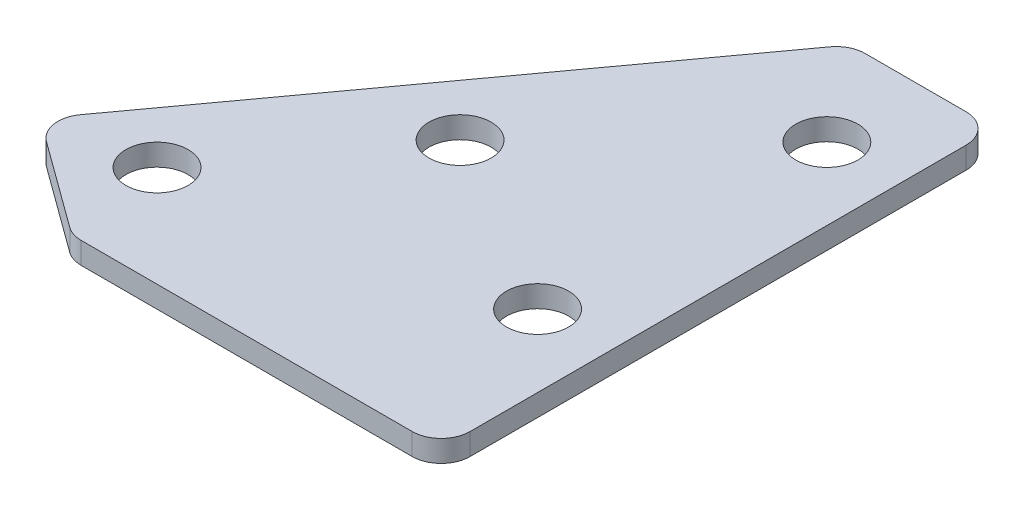
ISO-10303-21;
HEADER;
FILE_DESCRIPTION(('STEP AP214'),'2;1');
FILE_NAME('part.step','',(''),(''),'','','');
FILE_SCHEMA(('AUTOMOTIVE_DESIGN { 1 0 10303 214 1 1 1 1 }'));
ENDSEC;
DATA;
#1=APPLICATION_CONTEXT('core data for automotive mechanical design processes');
#2=APPLICATION_PROTOCOL_DEFINITION('international standard','automotive_design',2000,#1);
#3=PRODUCT_CONTEXT('',#1,'mechanical');
#4=PRODUCT('Part','Part','',(#3));
#5=PRODUCT_RELATED_PRODUCT_CATEGORY('part','',(#4));
#6=PRODUCT_DEFINITION_FORMATION('','',#4);
#7=PRODUCT_DEFINITION_CONTEXT('part definition',#1,'design');
#8=PRODUCT_DEFINITION('design','',#6,#7);
#9=PRODUCT_DEFINITION_SHAPE('','',#8);
#10=(LENGTH_UNIT() NAMED_UNIT(*) SI_UNIT(.MILLI.,.METRE.));
#11=(NAMED_UNIT(*) PLANE_ANGLE_UNIT() SI_UNIT($,.RADIAN.));
#12=(NAMED_UNIT(*) SI_UNIT($,.STERADIAN.) SOLID_ANGLE_UNIT());
#13=UNCERTAINTY_MEASURE_WITH_UNIT(LENGTH_MEASURE(1.E-05),#10,'distance_accuracy_value','');
#14=(GEOMETRIC_REPRESENTATION_CONTEXT(3) GLOBAL_UNCERTAINTY_ASSIGNED_CONTEXT((#13)) GLOBAL_UNIT_ASSIGNED_CONTEXT((#10,
#11,#12)) REPRESENTATION_CONTEXT('',''));
#15=CARTESIAN_POINT('',(0.,0.,0.));
#16=DIRECTION('',(0.,0.,1.));
#17=DIRECTION('',(1.,0.,0.));
#18=AXIS2_PLACEMENT_3D('',#15,#16,#17);
#19=CARTESIAN_POINT('',(0.,1.5,0.));
#20=DIRECTION('',(0.,1.,0.));
#21=DIRECTION('',(0.,0.,1.));
#22=AXIS2_PLACEMENT_3D('',#19,#20,#21);
#23=PLANE('',#22);
#24=CARTESIAN_POINT('',(167.865866110565,1.5,-230.317283317926));
#25=DIRECTION('',(0.,1.,0.));
#26=DIRECTION('',(0.,0.,1.));
#27=AXIS2_PLACEMENT_3D('',#24,#25,#26);
#28=CIRCLE('',#27,2.15000000000002);
#29=CARTESIAN_POINT('',(167.865866110565,1.5,-228.167283317926));
#30=VERTEX_POINT('',#29);
#31=EDGE_CURVE('E221',#30,#30,#28,.T.);
#32=ORIENTED_EDGE('',*,*,#31,.F.);
#33=EDGE_LOOP('',(#32));
#34=FACE_BOUND('',#33,.T.);
#35=CARTESIAN_POINT('',(176.700911695332,1.5,-242.439245597817));
#36=DIRECTION('',(0.,1.,0.));
#37=DIRECTION('',(0.,0.,1.));
#38=AXIS2_PLACEMENT_3D('',#35,#36,#37);
#39=CIRCLE('',#38,2.15000000000002);
#40=CARTESIAN_POINT('',(176.700911695332,1.5,-240.289245597817));
#41=VERTEX_POINT('',#40);
#42=EDGE_CURVE('E143',#41,#41,#39,.T.);
#43=ORIENTED_EDGE('',*,*,#42,.F.);
#44=EDGE_LOOP('',(#43));
#45=FACE_BOUND('',#44,.T.);
#46=DIRECTION('',(0.80813081865939,0.,0.589003038984438));
#47=VECTOR('',#46,1.);
#48=CARTESIAN_POINT('',(168.96150500894,1.5,-223.331614029707));
#49=LINE('',#48,#47);
#50=CARTESIAN_POINT('',(162.496458459665,1.5,-228.043638341582));
#51=VERTEX_POINT('',#50);
#52=CARTESIAN_POINT('',(168.435003825314,1.5,-223.715352392388));
#53=VERTEX_POINT('',#52);
#54=EDGE_CURVE('E152',#51,#53,#49,.T.);
#55=ORIENTED_EDGE('',*,*,#54,.T.);
#56=CARTESIAN_POINT('',(169.613009903283,1.5,-225.331614029707));
#57=DIRECTION('',(0.,1.,0.));
#58=DIRECTION('',(0.,0.,1.));
#59=AXIS2_PLACEMENT_3D('',#56,#57,#58);
#60=CIRCLE('',#59,2.);
#61=CARTESIAN_POINT('',(169.613009903283,1.5,-223.331614029707));
#62=VERTEX_POINT('',#61);
#63=EDGE_CURVE('E177',#53,#62,#60,.T.);
#64=ORIENTED_EDGE('',*,*,#63,.T.);
#65=DIRECTION('',(1.,0.,0.));
#66=VECTOR('',#65,1.);
#67=CARTESIAN_POINT('',(194.5,1.5,-223.331614029707));
#68=LINE('',#67,#66);
#69=CARTESIAN_POINT('',(192.5,1.5,-223.331614029707));
#70=VERTEX_POINT('',#69);
#71=EDGE_CURVE('E134',#62,#70,#68,.T.);
#72=ORIENTED_EDGE('',*,*,#71,.T.);
#73=CARTESIAN_POINT('',(192.5,1.5,-225.331614029707));
#74=DIRECTION('',(0.,1.,0.));
#75=DIRECTION('',(0.,0.,1.));
#76=AXIS2_PLACEMENT_3D('',#73,#74,#75);
#77=CIRCLE('',#76,2.);
#78=CARTESIAN_POINT('',(194.5,1.5,-225.331614029707));
#79=VERTEX_POINT('',#78);
#80=EDGE_CURVE('E173',#70,#79,#77,.T.);
#81=ORIENTED_EDGE('',*,*,#80,.T.);
#82=DIRECTION('',(0.,0.,-1.));
#83=VECTOR('',#82,1.);
#84=CARTESIAN_POINT('',(194.5,1.5,-261.628762235857));
#85=LINE('',#84,#83);
#86=CARTESIAN_POINT('',(194.5,1.5,-259.628762235857));
#87=VERTEX_POINT('',#86);
#88=EDGE_CURVE('E200',#79,#87,#85,.T.);
#89=ORIENTED_EDGE('',*,*,#88,.T.);
#90=CARTESIAN_POINT('',(192.5,1.5,-259.628762235857));
#91=DIRECTION('',(0.,1.,0.));
#92=DIRECTION('',(0.,0.,1.));
#93=AXIS2_PLACEMENT_3D('',#90,#91,#92);
#94=CIRCLE('',#93,2.);
#95=CARTESIAN_POINT('',(192.5,1.5,-261.628762235857));
#96=VERTEX_POINT('',#95);
#97=EDGE_CURVE('E171',#87,#96,#94,.T.);
#98=ORIENTED_EDGE('',*,*,#97,.T.);
#99=DIRECTION('',(-1.,0.,0.));
#100=VECTOR('',#99,1.);
#101=CARTESIAN_POINT('',(184.5,1.5,-261.628762235857));
#102=LINE('',#101,#100);
#103=CARTESIAN_POINT('',(185.517154528761,1.5,-261.628762235857));
#104=VERTEX_POINT('',#103);
#105=EDGE_CURVE('E191',#96,#104,#102,.T.);
#106=ORIENTED_EDGE('',*,*,#105,.T.);
#107=CARTESIAN_POINT('',(185.517154528761,1.5,-259.628762235857));
#108=DIRECTION('',(0.,1.,0.));
#109=DIRECTION('',(0.,0.,1.));
#110=AXIS2_PLACEMENT_3D('',#107,#108,#109);
#111=CIRCLE('',#110,2.);
#112=CARTESIAN_POINT('',(183.900892891443,1.5,-260.806768313826));
#113=VERTEX_POINT('',#112);
#114=EDGE_CURVE('E57',#104,#113,#111,.T.);
#115=ORIENTED_EDGE('',*,*,#114,.T.);
#116=DIRECTION('',(-0.58900303898444,0.,0.808130818659389));
#117=VECTOR('',#116,1.);
#118=CARTESIAN_POINT('',(184.5,1.5,-261.628762235857));
#119=LINE('',#118,#117);
#120=CARTESIAN_POINT('',(162.058202900315,1.5,-230.83790605687));
#121=VERTEX_POINT('',#120);
#122=EDGE_CURVE('E199',#113,#121,#119,.T.);
#123=ORIENTED_EDGE('',*,*,#122,.T.);
#124=CARTESIAN_POINT('',(163.674464537634,1.5,-229.659899978901));
#125=DIRECTION('',(0.,1.,0.));
#126=DIRECTION('',(0.,0.,1.));
#127=AXIS2_PLACEMENT_3D('',#124,#125,#126);
#128=CIRCLE('',#127,2.);
#129=EDGE_CURVE('E175',#121,#51,#128,.T.);
#130=ORIENTED_EDGE('',*,*,#129,.T.);
#131=EDGE_LOOP('',(#55,#64,#72,#81,#89,#98,#106,#115,#123,#130));
#132=FACE_BOUND('',#131,.T.);
#133=CARTESIAN_POINT('',(189.5,1.5,-235.));
#134=DIRECTION('',(0.,1.,0.));
#135=DIRECTION('',(0.,0.,1.));
#136=AXIS2_PLACEMENT_3D('',#133,#134,#135);
#137=CIRCLE('',#136,2.15000000000002);
#138=CARTESIAN_POINT('',(189.5,1.5,-232.85));
#139=VERTEX_POINT('',#138);
#140=EDGE_CURVE('E216',#139,#139,#137,.T.);
#141=ORIENTED_EDGE('',*,*,#140,.F.);
#142=EDGE_LOOP('',(#141));
#143=FACE_BOUND('',#142,.T.);
#144=CARTESIAN_POINT('',(189.5,1.5,-255.));
#145=DIRECTION('',(0.,1.,0.));
#146=DIRECTION('',(0.,0.,1.));
#147=AXIS2_PLACEMENT_3D('',#144,#145,#146);
#148=CIRCLE('',#147,2.15000000000002);
#149=CARTESIAN_POINT('',(189.5,1.5,-252.85));
#150=VERTEX_POINT('',#149);
#151=EDGE_CURVE('E227',#150,#150,#148,.T.);
#152=ORIENTED_EDGE('',*,*,#151,.F.);
#153=EDGE_LOOP('',(#152));
#154=FACE_BOUND('',#153,.T.);
#155=ADVANCED_FACE('F35',(#34,#45,#132,#143,#154),#23,.T.);
#156=CARTESIAN_POINT('',(0.,0.,0.));
#157=DIRECTION('',(0.,1.,0.));
#158=DIRECTION('',(0.,0.,1.));
#159=AXIS2_PLACEMENT_3D('',#156,#157,#158);
#160=PLANE('',#159);
#161=DIRECTION('',(1.,0.,0.));
#162=VECTOR('',#161,1.);
#163=CARTESIAN_POINT('',(194.5,0.,-223.331614029707));
#164=LINE('',#163,#162);
#165=CARTESIAN_POINT('',(169.613009903283,0.,-223.331614029707));
#166=VERTEX_POINT('',#165);
#167=CARTESIAN_POINT('',(192.5,0.,-223.331614029707));
#168=VERTEX_POINT('',#167);
#169=EDGE_CURVE('E131',#166,#168,#164,.T.);
#170=ORIENTED_EDGE('',*,*,#169,.F.);
#171=CARTESIAN_POINT('',(169.613009903283,0.,-225.331614029707));
#172=DIRECTION('',(0.,1.,0.));
#173=DIRECTION('',(0.,0.,1.));
#174=AXIS2_PLACEMENT_3D('',#171,#172,#173);
#175=CIRCLE('',#174,2.);
#176=CARTESIAN_POINT('',(168.435003825314,0.,-223.715352392388));
#177=VERTEX_POINT('',#176);
#178=EDGE_CURVE('E114',#166,#177,#175,.F.);
#179=ORIENTED_EDGE('',*,*,#178,.T.);
#180=DIRECTION('',(0.80813081865939,0.,0.589003038984438));
#181=VECTOR('',#180,1.);
#182=CARTESIAN_POINT('',(168.96150500894,0.,-223.331614029707));
#183=LINE('',#182,#181);
#184=CARTESIAN_POINT('',(162.496458459665,0.,-228.043638341582));
#185=VERTEX_POINT('',#184);
#186=EDGE_CURVE('E159',#185,#177,#183,.T.);
#187=ORIENTED_EDGE('',*,*,#186,.F.);
#188=CARTESIAN_POINT('',(163.674464537634,0.,-229.659899978901));
#189=DIRECTION('',(0.,1.,0.));
#190=DIRECTION('',(0.,0.,1.));
#191=AXIS2_PLACEMENT_3D('',#188,#189,#190);
#192=CIRCLE('',#191,2.);
#193=CARTESIAN_POINT('',(162.058202900315,0.,-230.83790605687));
#194=VERTEX_POINT('',#193);
#195=EDGE_CURVE('E125',#185,#194,#192,.F.);
#196=ORIENTED_EDGE('',*,*,#195,.T.);
#197=DIRECTION('',(-0.58900303898444,0.,0.808130818659389));
#198=VECTOR('',#197,1.);
#199=CARTESIAN_POINT('',(184.5,0.,-261.628762235857));
#200=LINE('',#199,#198);
#201=CARTESIAN_POINT('',(183.900892891443,0.,-260.806768313826));
#202=VERTEX_POINT('',#201);
#203=EDGE_CURVE('E157',#202,#194,#200,.T.);
#204=ORIENTED_EDGE('',*,*,#203,.F.);
#205=CARTESIAN_POINT('',(185.517154528761,0.,-259.628762235857));
#206=DIRECTION('',(0.,1.,0.));
#207=DIRECTION('',(0.,0.,1.));
#208=AXIS2_PLACEMENT_3D('',#205,#206,#207);
#209=CIRCLE('',#208,2.);
#210=CARTESIAN_POINT('',(185.517154528761,0.,-261.628762235857));
#211=VERTEX_POINT('',#210);
#212=EDGE_CURVE('E135',#202,#211,#209,.F.);
#213=ORIENTED_EDGE('',*,*,#212,.T.);
#214=DIRECTION('',(-1.,0.,0.));
#215=VECTOR('',#214,1.);
#216=CARTESIAN_POINT('',(184.5,0.,-261.628762235857));
#217=LINE('',#216,#215);
#218=CARTESIAN_POINT('',(192.5,0.,-261.628762235857));
#219=VERTEX_POINT('',#218);
#220=EDGE_CURVE('E146',#219,#211,#217,.T.);
#221=ORIENTED_EDGE('',*,*,#220,.F.);
#222=CARTESIAN_POINT('',(192.5,0.,-259.628762235857));
#223=DIRECTION('',(0.,1.,0.));
#224=DIRECTION('',(0.,0.,1.));
#225=AXIS2_PLACEMENT_3D('',#222,#223,#224);
#226=CIRCLE('',#225,2.);
#227=CARTESIAN_POINT('',(194.5,0.,-259.628762235857));
#228=VERTEX_POINT('',#227);
#229=EDGE_CURVE('E163',#219,#228,#226,.F.);
#230=ORIENTED_EDGE('',*,*,#229,.T.);
#231=DIRECTION('',(0.,0.,-1.));
#232=VECTOR('',#231,1.);
#233=CARTESIAN_POINT('',(194.5,0.,-261.628762235857));
#234=LINE('',#233,#232);
#235=CARTESIAN_POINT('',(194.5,0.,-225.331614029707));
#236=VERTEX_POINT('',#235);
#237=EDGE_CURVE('E142',#236,#228,#234,.T.);
#238=ORIENTED_EDGE('',*,*,#237,.F.);
#239=CARTESIAN_POINT('',(192.5,0.,-225.331614029707));
#240=DIRECTION('',(0.,1.,0.));
#241=DIRECTION('',(0.,0.,1.));
#242=AXIS2_PLACEMENT_3D('',#239,#240,#241);
#243=CIRCLE('',#242,2.);
#244=EDGE_CURVE('E141',#236,#168,#243,.F.);
#245=ORIENTED_EDGE('',*,*,#244,.T.);
#246=EDGE_LOOP('',(#170,#179,#187,#196,#204,#213,#221,#230,#238,#245));
#247=FACE_BOUND('',#246,.T.);
#248=CARTESIAN_POINT('',(176.700911695332,0.,-242.439245597817));
#249=DIRECTION('',(0.,1.,0.));
#250=DIRECTION('',(0.,0.,1.));
#251=AXIS2_PLACEMENT_3D('',#248,#249,#250);
#252=CIRCLE('',#251,2.15000000000002);
#253=CARTESIAN_POINT('',(176.700911695332,0.,-240.289245597817));
#254=VERTEX_POINT('',#253);
#255=EDGE_CURVE('E149',#254,#254,#252,.T.);
#256=ORIENTED_EDGE('',*,*,#255,.T.);
#257=EDGE_LOOP('',(#256));
#258=FACE_BOUND('',#257,.T.);
#259=CARTESIAN_POINT('',(189.5,0.,-235.));
#260=DIRECTION('',(0.,1.,0.));
#261=DIRECTION('',(0.,0.,1.));
#262=AXIS2_PLACEMENT_3D('',#259,#260,#261);
#263=CIRCLE('',#262,2.15000000000002);
#264=CARTESIAN_POINT('',(189.5,0.,-232.85));
#265=VERTEX_POINT('',#264);
#266=EDGE_CURVE('E218',#265,#265,#263,.T.);
#267=ORIENTED_EDGE('',*,*,#266,.T.);
#268=EDGE_LOOP('',(#267));
#269=FACE_BOUND('',#268,.T.);
#270=CARTESIAN_POINT('',(167.865866110565,0.,-230.317283317926));
#271=DIRECTION('',(0.,1.,0.));
#272=DIRECTION('',(0.,0.,1.));
#273=AXIS2_PLACEMENT_3D('',#270,#271,#272);
#274=CIRCLE('',#273,2.15000000000002);
#275=CARTESIAN_POINT('',(167.865866110565,0.,-228.167283317926));
#276=VERTEX_POINT('',#275);
#277=EDGE_CURVE('E224',#276,#276,#274,.T.);
#278=ORIENTED_EDGE('',*,*,#277,.T.);
#279=EDGE_LOOP('',(#278));
#280=FACE_BOUND('',#279,.T.);
#281=CARTESIAN_POINT('',(189.5,0.,-255.));
#282=DIRECTION('',(0.,1.,0.));
#283=DIRECTION('',(0.,0.,1.));
#284=AXIS2_PLACEMENT_3D('',#281,#282,#283);
#285=CIRCLE('',#284,2.15000000000002);
#286=CARTESIAN_POINT('',(189.5,0.,-252.85));
#287=VERTEX_POINT('',#286);
#288=EDGE_CURVE('E230',#287,#287,#285,.T.);
#289=ORIENTED_EDGE('',*,*,#288,.T.);
#290=EDGE_LOOP('',(#289));
#291=FACE_BOUND('',#290,.T.);
#292=ADVANCED_FACE('F138',(#247,#258,#269,#280,#291),#160,.F.);
#293=CARTESIAN_POINT('',(194.5,1.5,-223.331614029707));
#294=DIRECTION('',(0.,0.,-1.));
#295=DIRECTION('',(-1.,0.,0.));
#296=AXIS2_PLACEMENT_3D('',#293,#294,#295);
#297=PLANE('',#296);
#298=ORIENTED_EDGE('',*,*,#71,.F.);
#299=DIRECTION('',(0.,-1.,0.));
#300=VECTOR('',#299,1.);
#301=CARTESIAN_POINT('',(169.613009903283,1.5,-223.331614029707));
#302=LINE('',#301,#300);
#303=EDGE_CURVE('E118',#62,#166,#302,.T.);
#304=ORIENTED_EDGE('',*,*,#303,.T.);
#305=ORIENTED_EDGE('',*,*,#169,.T.);
#306=DIRECTION('',(0.,-1.,0.));
#307=VECTOR('',#306,1.);
#308=CARTESIAN_POINT('',(192.5,1.5,-223.331614029707));
#309=LINE('',#308,#307);
#310=EDGE_CURVE('E136',#168,#70,#309,.F.);
#311=ORIENTED_EDGE('',*,*,#310,.T.);
#312=EDGE_LOOP('',(#298,#304,#305,#311));
#313=FACE_BOUND('',#312,.T.);
#314=ADVANCED_FACE('F130',(#313),#297,.F.);
#315=CARTESIAN_POINT('',(194.5,1.5,-261.628762235857));
#316=DIRECTION('',(-1.,0.,0.));
#317=DIRECTION('',(0.,0.,1.));
#318=AXIS2_PLACEMENT_3D('',#315,#316,#317);
#319=PLANE('',#318);
#320=ORIENTED_EDGE('',*,*,#88,.F.);
#321=DIRECTION('',(0.,-1.,0.));
#322=VECTOR('',#321,1.);
#323=CARTESIAN_POINT('',(194.5,1.5,-225.331614029707));
#324=LINE('',#323,#322);
#325=EDGE_CURVE('E185',#79,#236,#324,.T.);
#326=ORIENTED_EDGE('',*,*,#325,.T.);
#327=ORIENTED_EDGE('',*,*,#237,.T.);
#328=DIRECTION('',(0.,-1.,0.));
#329=VECTOR('',#328,1.);
#330=CARTESIAN_POINT('',(194.5,1.5,-259.628762235857));
#331=LINE('',#330,#329);
#332=EDGE_CURVE('E183',#228,#87,#331,.F.);
#333=ORIENTED_EDGE('',*,*,#332,.T.);
#334=EDGE_LOOP('',(#320,#326,#327,#333));
#335=FACE_BOUND('',#334,.T.);
#336=ADVANCED_FACE('F258',(#335),#319,.F.);
#337=CARTESIAN_POINT('',(184.5,1.5,-261.628762235857));
#338=DIRECTION('',(0.,0.,1.));
#339=DIRECTION('',(1.,0.,0.));
#340=AXIS2_PLACEMENT_3D('',#337,#338,#339);
#341=PLANE('',#340);
#342=ORIENTED_EDGE('',*,*,#105,.F.);
#343=DIRECTION('',(0.,-1.,0.));
#344=VECTOR('',#343,1.);
#345=CARTESIAN_POINT('',(192.5,1.5,-261.628762235857));
#346=LINE('',#345,#344);
#347=EDGE_CURVE('E11',#96,#219,#346,.T.);
#348=ORIENTED_EDGE('',*,*,#347,.T.);
#349=ORIENTED_EDGE('',*,*,#220,.T.);
#350=DIRECTION('',(0.,-1.,0.));
#351=VECTOR('',#350,1.);
#352=CARTESIAN_POINT('',(185.517154528761,1.5,-261.628762235857));
#353=LINE('',#352,#351);
#354=EDGE_CURVE('E43',#211,#104,#353,.F.);
#355=ORIENTED_EDGE('',*,*,#354,.T.);
#356=EDGE_LOOP('',(#342,#348,#349,#355));
#357=FACE_BOUND('',#356,.T.);
#358=ADVANCED_FACE('F190',(#357),#341,.F.);
#359=CARTESIAN_POINT('',(184.5,1.5,-261.628762235857));
#360=DIRECTION('',(0.808130818659389,0.,0.58900303898444));
#361=DIRECTION('',(0.58900303898444,0.,-0.808130818659389));
#362=AXIS2_PLACEMENT_3D('',#359,#360,#361);
#363=PLANE('',#362);
#364=ORIENTED_EDGE('',*,*,#203,.T.);
#365=DIRECTION('',(0.,-1.,0.));
#366=VECTOR('',#365,1.);
#367=CARTESIAN_POINT('',(162.058202900315,1.5,-230.83790605687));
#368=LINE('',#367,#366);
#369=EDGE_CURVE('E50',#194,#121,#368,.F.);
#370=ORIENTED_EDGE('',*,*,#369,.T.);
#371=ORIENTED_EDGE('',*,*,#122,.F.);
#372=DIRECTION('',(0.,-1.,0.));
#373=VECTOR('',#372,1.);
#374=CARTESIAN_POINT('',(183.900892891443,1.5,-260.806768313826));
#375=LINE('',#374,#373);
#376=EDGE_CURVE('E179',#113,#202,#375,.T.);
#377=ORIENTED_EDGE('',*,*,#376,.T.);
#378=EDGE_LOOP('',(#364,#370,#371,#377));
#379=FACE_BOUND('',#378,.T.);
#380=ADVANCED_FACE('F204',(#379),#363,.F.);
#381=CARTESIAN_POINT('',(168.96150500894,1.5,-223.331614029707));
#382=DIRECTION('',(0.589003038984438,0.,-0.80813081865939));
#383=DIRECTION('',(-0.80813081865939,0.,-0.589003038984438));
#384=AXIS2_PLACEMENT_3D('',#381,#382,#383);
#385=PLANE('',#384);
#386=ORIENTED_EDGE('',*,*,#186,.T.);
#387=DIRECTION('',(0.,-1.,0.));
#388=VECTOR('',#387,1.);
#389=CARTESIAN_POINT('',(168.435003825314,1.5,-223.715352392388));
#390=LINE('',#389,#388);
#391=EDGE_CURVE('E119',#177,#53,#390,.F.);
#392=ORIENTED_EDGE('',*,*,#391,.T.);
#393=ORIENTED_EDGE('',*,*,#54,.F.);
#394=DIRECTION('',(0.,-1.,0.));
#395=VECTOR('',#394,1.);
#396=CARTESIAN_POINT('',(162.496458459665,1.5,-228.043638341582));
#397=LINE('',#396,#395);
#398=EDGE_CURVE('E124',#51,#185,#397,.T.);
#399=ORIENTED_EDGE('',*,*,#398,.T.);
#400=EDGE_LOOP('',(#386,#392,#393,#399));
#401=FACE_BOUND('',#400,.T.);
#402=ADVANCED_FACE('F211',(#401),#385,.F.);
#403=CARTESIAN_POINT('',(176.700911695332,1.5,-242.439245597817));
#404=DIRECTION('',(0.,-1.,0.));
#405=DIRECTION('',(0.,0.,-1.));
#406=AXIS2_PLACEMENT_3D('',#403,#404,#405);
#407=CYLINDRICAL_SURFACE('',#406,2.15000000000002);
#408=ORIENTED_EDGE('',*,*,#42,.T.);
#409=EDGE_LOOP('',(#408));
#410=FACE_BOUND('',#409,.T.);
#411=ORIENTED_EDGE('',*,*,#255,.F.);
#412=EDGE_LOOP('',(#411));
#413=FACE_BOUND('',#412,.T.);
#414=ADVANCED_FACE('F249',(#410,#413),#407,.F.);
#415=CARTESIAN_POINT('',(189.5,1.5,-235.));
#416=DIRECTION('',(0.,-1.,0.));
#417=DIRECTION('',(0.,0.,-1.));
#418=AXIS2_PLACEMENT_3D('',#415,#416,#417);
#419=CYLINDRICAL_SURFACE('',#418,2.15000000000002);
#420=ORIENTED_EDGE('',*,*,#140,.T.);
#421=EDGE_LOOP('',(#420));
#422=FACE_BOUND('',#421,.T.);
#423=ORIENTED_EDGE('',*,*,#266,.F.);
#424=EDGE_LOOP('',(#423));
#425=FACE_BOUND('',#424,.T.);
#426=ADVANCED_FACE('F365',(#422,#425),#419,.F.);
#427=CARTESIAN_POINT('',(167.865866110565,1.5,-230.317283317926));
#428=DIRECTION('',(0.,-1.,0.));
#429=DIRECTION('',(0.,0.,-1.));
#430=AXIS2_PLACEMENT_3D('',#427,#428,#429);
#431=CYLINDRICAL_SURFACE('',#430,2.15000000000002);
#432=ORIENTED_EDGE('',*,*,#31,.T.);
#433=EDGE_LOOP('',(#432));
#434=FACE_BOUND('',#433,.T.);
#435=ORIENTED_EDGE('',*,*,#277,.F.);
#436=EDGE_LOOP('',(#435));
#437=FACE_BOUND('',#436,.T.);
#438=ADVANCED_FACE('F356',(#434,#437),#431,.F.);
#439=CARTESIAN_POINT('',(189.5,1.5,-255.));
#440=DIRECTION('',(0.,-1.,0.));
#441=DIRECTION('',(0.,0.,-1.));
#442=AXIS2_PLACEMENT_3D('',#439,#440,#441);
#443=CYLINDRICAL_SURFACE('',#442,2.15000000000002);
#444=ORIENTED_EDGE('',*,*,#151,.T.);
#445=EDGE_LOOP('',(#444));
#446=FACE_BOUND('',#445,.T.);
#447=ORIENTED_EDGE('',*,*,#288,.F.);
#448=EDGE_LOOP('',(#447));
#449=FACE_BOUND('',#448,.T.);
#450=ADVANCED_FACE('F236',(#446,#449),#443,.F.);
#451=CARTESIAN_POINT('',(169.613009903283,1.5,-225.331614029707));
#452=DIRECTION('',(0.,-1.,0.));
#453=DIRECTION('',(0.,0.,-1.));
#454=AXIS2_PLACEMENT_3D('',#451,#452,#453);
#455=CYLINDRICAL_SURFACE('',#454,2.);
#456=ORIENTED_EDGE('',*,*,#63,.F.);
#457=ORIENTED_EDGE('',*,*,#391,.F.);
#458=ORIENTED_EDGE('',*,*,#178,.F.);
#459=ORIENTED_EDGE('',*,*,#303,.F.);
#460=EDGE_LOOP('',(#456,#457,#458,#459));
#461=FACE_BOUND('',#460,.T.);
#462=ADVANCED_FACE('F117',(#461),#455,.T.);
#463=CARTESIAN_POINT('',(163.674464537634,1.5,-229.659899978901));
#464=DIRECTION('',(0.,-1.,0.));
#465=DIRECTION('',(0.,0.,-1.));
#466=AXIS2_PLACEMENT_3D('',#463,#464,#465);
#467=CYLINDRICAL_SURFACE('',#466,2.);
#468=ORIENTED_EDGE('',*,*,#129,.F.);
#469=ORIENTED_EDGE('',*,*,#369,.F.);
#470=ORIENTED_EDGE('',*,*,#195,.F.);
#471=ORIENTED_EDGE('',*,*,#398,.F.);
#472=EDGE_LOOP('',(#468,#469,#470,#471));
#473=FACE_BOUND('',#472,.T.);
#474=ADVANCED_FACE('F208',(#473),#467,.T.);
#475=CARTESIAN_POINT('',(192.5,1.5,-225.331614029707));
#476=DIRECTION('',(0.,-1.,0.));
#477=DIRECTION('',(0.,0.,-1.));
#478=AXIS2_PLACEMENT_3D('',#475,#476,#477);
#479=CYLINDRICAL_SURFACE('',#478,2.);
#480=ORIENTED_EDGE('',*,*,#80,.F.);
#481=ORIENTED_EDGE('',*,*,#310,.F.);
#482=ORIENTED_EDGE('',*,*,#244,.F.);
#483=ORIENTED_EDGE('',*,*,#325,.F.);
#484=EDGE_LOOP('',(#480,#481,#482,#483));
#485=FACE_BOUND('',#484,.T.);
#486=ADVANCED_FACE('F268',(#485),#479,.T.);
#487=CARTESIAN_POINT('',(192.5,1.5,-259.628762235857));
#488=DIRECTION('',(0.,-1.,0.));
#489=DIRECTION('',(0.,0.,-1.));
#490=AXIS2_PLACEMENT_3D('',#487,#488,#489);
#491=CYLINDRICAL_SURFACE('',#490,2.);
#492=ORIENTED_EDGE('',*,*,#97,.F.);
#493=ORIENTED_EDGE('',*,*,#332,.F.);
#494=ORIENTED_EDGE('',*,*,#229,.F.);
#495=ORIENTED_EDGE('',*,*,#347,.F.);
#496=EDGE_LOOP('',(#492,#493,#494,#495));
#497=FACE_BOUND('',#496,.T.);
#498=ADVANCED_FACE('F270',(#497),#491,.T.);
#499=CARTESIAN_POINT('',(185.517154528761,1.5,-259.628762235857));
#500=DIRECTION('',(0.,-1.,0.));
#501=DIRECTION('',(0.,0.,-1.));
#502=AXIS2_PLACEMENT_3D('',#499,#500,#501);
#503=CYLINDRICAL_SURFACE('',#502,2.);
#504=ORIENTED_EDGE('',*,*,#114,.F.);
#505=ORIENTED_EDGE('',*,*,#354,.F.);
#506=ORIENTED_EDGE('',*,*,#212,.F.);
#507=ORIENTED_EDGE('',*,*,#376,.F.);
#508=EDGE_LOOP('',(#504,#505,#506,#507));
#509=FACE_BOUND('',#508,.T.);
#510=ADVANCED_FACE('F37',(#509),#503,.T.);
#511=CLOSED_SHELL('',(#155,#292,#314,#336,#358,#380,#402,#414,#426,#438,#450,#462,#474,#486,
#498,#510));
#512=MANIFOLD_SOLID_BREP('B2',#511);
#513=ADVANCED_BREP_SHAPE_REPRESENTATION('',(#18,#512),#14);
#514=SHAPE_DEFINITION_REPRESENTATION(#9,#513);
ENDSEC;
END-ISO-10303-21;
